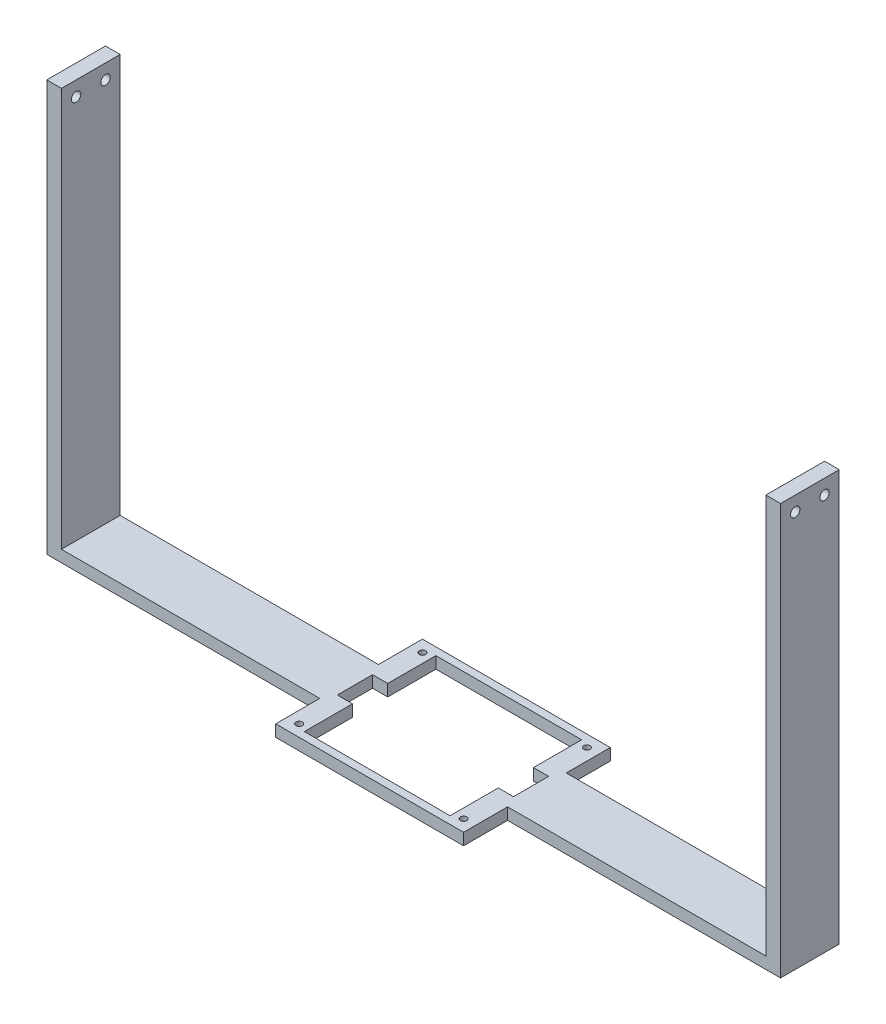
ISO-10303-21;
HEADER;
FILE_DESCRIPTION(('STEP AP214'),'2;1');
FILE_NAME('part.step','',(''),(''),'','','');
FILE_SCHEMA(('AUTOMOTIVE_DESIGN { 1 0 10303 214 1 1 1 1 }'));
ENDSEC;
DATA;
#1=APPLICATION_CONTEXT('core data for automotive mechanical design processes');
#2=APPLICATION_PROTOCOL_DEFINITION('international standard','automotive_design',2000,#1);
#3=PRODUCT_CONTEXT('',#1,'mechanical');
#4=PRODUCT('Part','Part','',(#3));
#5=PRODUCT_RELATED_PRODUCT_CATEGORY('part','',(#4));
#6=PRODUCT_DEFINITION_FORMATION('','',#4);
#7=PRODUCT_DEFINITION_CONTEXT('part definition',#1,'design');
#8=PRODUCT_DEFINITION('design','',#6,#7);
#9=PRODUCT_DEFINITION_SHAPE('','',#8);
#10=(LENGTH_UNIT() NAMED_UNIT(*) SI_UNIT(.MILLI.,.METRE.));
#11=(NAMED_UNIT(*) PLANE_ANGLE_UNIT() SI_UNIT($,.RADIAN.));
#12=(NAMED_UNIT(*) SI_UNIT($,.STERADIAN.) SOLID_ANGLE_UNIT());
#13=UNCERTAINTY_MEASURE_WITH_UNIT(LENGTH_MEASURE(1.E-05),#10,'distance_accuracy_value','');
#14=(GEOMETRIC_REPRESENTATION_CONTEXT(3) GLOBAL_UNCERTAINTY_ASSIGNED_CONTEXT((#13)) GLOBAL_UNIT_ASSIGNED_CONTEXT((#10,
#11,#12)) REPRESENTATION_CONTEXT('',''));
#15=CARTESIAN_POINT('',(0.,0.,0.));
#16=DIRECTION('',(0.,0.,1.));
#17=DIRECTION('',(1.,0.,0.));
#18=AXIS2_PLACEMENT_3D('',#15,#16,#17);
#19=CARTESIAN_POINT('',(-30.,4.,-6.));
#20=DIRECTION('',(0.,0.,1.));
#21=DIRECTION('',(1.,0.,0.));
#22=AXIS2_PLACEMENT_3D('',#19,#20,#21);
#23=PLANE('',#22);
#24=DIRECTION('',(0.,1.,0.));
#25=VECTOR('',#24,1.);
#26=CARTESIAN_POINT('',(24.8266606950776,4.,-6.));
#27=LINE('',#26,#25);
#28=CARTESIAN_POINT('',(24.8266606950776,0.,-6.));
#29=VERTEX_POINT('',#28);
#30=CARTESIAN_POINT('',(24.8266606950776,4.,-6.));
#31=VERTEX_POINT('',#30);
#32=EDGE_CURVE('E269',#29,#31,#27,.T.);
#33=ORIENTED_EDGE('',*,*,#32,.F.);
#34=DIRECTION('',(-1.,0.,0.));
#35=VECTOR('',#34,1.);
#36=CARTESIAN_POINT('',(-30.,0.,-6.));
#37=LINE('',#36,#35);
#38=CARTESIAN_POINT('',(30.,0.,-6.));
#39=VERTEX_POINT('',#38);
#40=EDGE_CURVE('E245',#39,#29,#37,.T.);
#41=ORIENTED_EDGE('',*,*,#40,.F.);
#42=DIRECTION('',(0.,-1.,0.));
#43=VECTOR('',#42,1.);
#44=CARTESIAN_POINT('',(30.,4.,-6.));
#45=LINE('',#44,#43);
#46=CARTESIAN_POINT('',(30.,4.,-6.));
#47=VERTEX_POINT('',#46);
#48=EDGE_CURVE('E442',#47,#39,#45,.T.);
#49=ORIENTED_EDGE('',*,*,#48,.F.);
#50=DIRECTION('',(-1.,0.,0.));
#51=VECTOR('',#50,1.);
#52=CARTESIAN_POINT('',(-30.,4.,-6.));
#53=LINE('',#52,#51);
#54=EDGE_CURVE('E415',#47,#31,#53,.T.);
#55=ORIENTED_EDGE('',*,*,#54,.T.);
#56=EDGE_LOOP('',(#33,#41,#49,#55));
#57=FACE_BOUND('',#56,.T.);
#58=ADVANCED_FACE('F35',(#57),#23,.T.);
#59=CARTESIAN_POINT('',(-30.,4.,6.));
#60=DIRECTION('',(0.,0.,-1.));
#61=DIRECTION('',(-1.,0.,0.));
#62=AXIS2_PLACEMENT_3D('',#59,#60,#61);
#63=PLANE('',#62);
#64=DIRECTION('',(0.,-1.,0.));
#65=VECTOR('',#64,1.);
#66=CARTESIAN_POINT('',(24.8266606950776,4.,6.));
#67=LINE('',#66,#65);
#68=CARTESIAN_POINT('',(24.8266606950776,4.,6.));
#69=VERTEX_POINT('',#68);
#70=CARTESIAN_POINT('',(24.8266606950776,0.,6.));
#71=VERTEX_POINT('',#70);
#72=EDGE_CURVE('E11',#69,#71,#67,.T.);
#73=ORIENTED_EDGE('',*,*,#72,.F.);
#74=DIRECTION('',(1.,0.,0.));
#75=VECTOR('',#74,1.);
#76=CARTESIAN_POINT('',(-30.,4.,6.));
#77=LINE('',#76,#75);
#78=CARTESIAN_POINT('',(30.,4.,6.));
#79=VERTEX_POINT('',#78);
#80=EDGE_CURVE('E421',#69,#79,#77,.T.);
#81=ORIENTED_EDGE('',*,*,#80,.T.);
#82=DIRECTION('',(0.,-1.,0.));
#83=VECTOR('',#82,1.);
#84=CARTESIAN_POINT('',(30.,4.,6.));
#85=LINE('',#84,#83);
#86=CARTESIAN_POINT('',(30.,0.,6.));
#87=VERTEX_POINT('',#86);
#88=EDGE_CURVE('E425',#79,#87,#85,.T.);
#89=ORIENTED_EDGE('',*,*,#88,.T.);
#90=DIRECTION('',(1.,0.,0.));
#91=VECTOR('',#90,1.);
#92=CARTESIAN_POINT('',(-30.,0.,6.));
#93=LINE('',#92,#91);
#94=EDGE_CURVE('E432',#71,#87,#93,.T.);
#95=ORIENTED_EDGE('',*,*,#94,.F.);
#96=EDGE_LOOP('',(#73,#81,#89,#95));
#97=FACE_BOUND('',#96,.T.);
#98=ADVANCED_FACE('F508',(#97),#63,.T.);
#99=CARTESIAN_POINT('',(125.,4.,9.99999999999997));
#100=DIRECTION('',(0.,0.,-1.));
#101=DIRECTION('',(-1.,0.,0.));
#102=AXIS2_PLACEMENT_3D('',#99,#100,#101);
#103=PLANE('',#102);
#104=DIRECTION('',(0.,1.,0.));
#105=VECTOR('',#104,1.);
#106=CARTESIAN_POINT('',(32.,0.,9.99999999999999));
#107=LINE('',#106,#105);
#108=CARTESIAN_POINT('',(32.,0.,9.99999999999999));
#109=VERTEX_POINT('',#108);
#110=CARTESIAN_POINT('',(32.,4.,9.99999999999999));
#111=VERTEX_POINT('',#110);
#112=EDGE_CURVE('E307',#109,#111,#107,.T.);
#113=ORIENTED_EDGE('',*,*,#112,.F.);
#114=DIRECTION('',(1.,0.,0.));
#115=VECTOR('',#114,1.);
#116=CARTESIAN_POINT('',(125.,0.,9.99999999999997));
#117=LINE('',#116,#115);
#118=CARTESIAN_POINT('',(125.,0.,9.99999999999997));
#119=VERTEX_POINT('',#118);
#120=EDGE_CURVE('E457',#109,#119,#117,.T.);
#121=ORIENTED_EDGE('',*,*,#120,.T.);
#122=DIRECTION('',(0.,-1.,0.));
#123=VECTOR('',#122,1.);
#124=CARTESIAN_POINT('',(125.,4.,9.99999999999997));
#125=LINE('',#124,#123);
#126=CARTESIAN_POINT('',(125.,140.,10.));
#127=VERTEX_POINT('',#126);
#128=EDGE_CURVE('E472',#127,#119,#125,.T.);
#129=ORIENTED_EDGE('',*,*,#128,.F.);
#130=DIRECTION('',(1.,0.,0.));
#131=VECTOR('',#130,1.);
#132=CARTESIAN_POINT('',(120.,140.,10.));
#133=LINE('',#132,#131);
#134=CARTESIAN_POINT('',(120.,140.,10.));
#135=VERTEX_POINT('',#134);
#136=EDGE_CURVE('E370',#135,#127,#133,.T.);
#137=ORIENTED_EDGE('',*,*,#136,.F.);
#138=DIRECTION('',(0.,1.,0.));
#139=VECTOR('',#138,1.);
#140=CARTESIAN_POINT('',(120.,0.,10.));
#141=LINE('',#140,#139);
#142=CARTESIAN_POINT('',(120.,4.,9.99999999999997));
#143=VERTEX_POINT('',#142);
#144=EDGE_CURVE('E365',#143,#135,#141,.T.);
#145=ORIENTED_EDGE('',*,*,#144,.F.);
#146=DIRECTION('',(1.,0.,0.));
#147=VECTOR('',#146,1.);
#148=CARTESIAN_POINT('',(125.,4.,9.99999999999997));
#149=LINE('',#148,#147);
#150=EDGE_CURVE('E450',#111,#143,#149,.T.);
#151=ORIENTED_EDGE('',*,*,#150,.F.);
#152=EDGE_LOOP('',(#113,#121,#129,#137,#145,#151));
#153=FACE_BOUND('',#152,.T.);
#154=ADVANCED_FACE('F522',(#153),#103,.F.);
#155=CARTESIAN_POINT('',(125.,4.,-10.0000000000001));
#156=DIRECTION('',(0.,0.,1.));
#157=DIRECTION('',(1.,0.,0.));
#158=AXIS2_PLACEMENT_3D('',#155,#156,#157);
#159=PLANE('',#158);
#160=DIRECTION('',(0.,1.,0.));
#161=VECTOR('',#160,1.);
#162=CARTESIAN_POINT('',(-32.,0.,-10.));
#163=LINE('',#162,#161);
#164=CARTESIAN_POINT('',(-32.,0.,-10.));
#165=VERTEX_POINT('',#164);
#166=CARTESIAN_POINT('',(-32.,4.,-10.));
#167=VERTEX_POINT('',#166);
#168=EDGE_CURVE('E331',#165,#167,#163,.T.);
#169=ORIENTED_EDGE('',*,*,#168,.F.);
#170=DIRECTION('',(-1.,0.,0.));
#171=VECTOR('',#170,1.);
#172=CARTESIAN_POINT('',(125.,0.,-10.0000000000001));
#173=LINE('',#172,#171);
#174=CARTESIAN_POINT('',(-125.,0.,-9.99999999999997));
#175=VERTEX_POINT('',#174);
#176=EDGE_CURVE('E463',#165,#175,#173,.T.);
#177=ORIENTED_EDGE('',*,*,#176,.T.);
#178=DIRECTION('',(0.,-1.,0.));
#179=VECTOR('',#178,1.);
#180=CARTESIAN_POINT('',(-125.,4.,-9.99999999999997));
#181=LINE('',#180,#179);
#182=CARTESIAN_POINT('',(-125.,140.,-9.99999999999997));
#183=VERTEX_POINT('',#182);
#184=EDGE_CURVE('E454',#183,#175,#181,.T.);
#185=ORIENTED_EDGE('',*,*,#184,.F.);
#186=DIRECTION('',(-1.,0.,0.));
#187=VECTOR('',#186,1.);
#188=CARTESIAN_POINT('',(-120.,140.,-9.99999999999997));
#189=LINE('',#188,#187);
#190=CARTESIAN_POINT('',(-120.,140.,-9.99999999999997));
#191=VERTEX_POINT('',#190);
#192=EDGE_CURVE('E402',#191,#183,#189,.T.);
#193=ORIENTED_EDGE('',*,*,#192,.F.);
#194=DIRECTION('',(0.,-1.,0.));
#195=VECTOR('',#194,1.);
#196=CARTESIAN_POINT('',(-120.,0.,-9.99999999999997));
#197=LINE('',#196,#195);
#198=CARTESIAN_POINT('',(-120.,4.,-9.99999999999997));
#199=VERTEX_POINT('',#198);
#200=EDGE_CURVE('E396',#191,#199,#197,.T.);
#201=ORIENTED_EDGE('',*,*,#200,.T.);
#202=DIRECTION('',(-1.,0.,0.));
#203=VECTOR('',#202,1.);
#204=CARTESIAN_POINT('',(125.,4.,-10.0000000000001));
#205=LINE('',#204,#203);
#206=EDGE_CURVE('E449',#167,#199,#205,.T.);
#207=ORIENTED_EDGE('',*,*,#206,.F.);
#208=EDGE_LOOP('',(#169,#177,#185,#193,#201,#207));
#209=FACE_BOUND('',#208,.T.);
#210=ADVANCED_FACE('F538',(#209),#159,.F.);
#211=CARTESIAN_POINT('',(0.,4.,0.));
#212=DIRECTION('',(0.,-1.,0.));
#213=DIRECTION('',(0.,0.,-1.));
#214=AXIS2_PLACEMENT_3D('',#211,#212,#213);
#215=PLANE('',#214);
#216=ORIENTED_EDGE('',*,*,#80,.F.);
#217=DIRECTION('',(0.,0.,-1.));
#218=VECTOR('',#217,1.);
#219=CARTESIAN_POINT('',(24.8266606950776,4.,-22.4076506082642));
#220=LINE('',#219,#218);
#221=CARTESIAN_POINT('',(24.8266606950776,4.,22.4076506082642));
#222=VERTEX_POINT('',#221);
#223=EDGE_CURVE('E255',#222,#69,#220,.T.);
#224=ORIENTED_EDGE('',*,*,#223,.F.);
#225=DIRECTION('',(1.,0.,0.));
#226=VECTOR('',#225,1.);
#227=CARTESIAN_POINT('',(-24.8266606950776,4.,22.4076506082642));
#228=LINE('',#227,#226);
#229=CARTESIAN_POINT('',(-24.8266606950776,4.,22.4076506082642));
#230=VERTEX_POINT('',#229);
#231=EDGE_CURVE('E246',#230,#222,#228,.T.);
#232=ORIENTED_EDGE('',*,*,#231,.F.);
#233=DIRECTION('',(0.,0.,1.));
#234=VECTOR('',#233,1.);
#235=CARTESIAN_POINT('',(-24.8266606950776,4.,-22.4076506082642));
#236=LINE('',#235,#234);
#237=CARTESIAN_POINT('',(-24.8266606950776,4.,6.));
#238=VERTEX_POINT('',#237);
#239=EDGE_CURVE('E259',#238,#230,#236,.T.);
#240=ORIENTED_EDGE('',*,*,#239,.F.);
#241=CARTESIAN_POINT('',(-30.,4.,6.));
#242=VERTEX_POINT('',#241);
#243=EDGE_CURVE('E422',#242,#238,#77,.T.);
#244=ORIENTED_EDGE('',*,*,#243,.F.);
#245=DIRECTION('',(0.,0.,1.));
#246=VECTOR('',#245,1.);
#247=CARTESIAN_POINT('',(-30.,4.,6.));
#248=LINE('',#247,#246);
#249=CARTESIAN_POINT('',(-30.,4.,-6.));
#250=VERTEX_POINT('',#249);
#251=EDGE_CURVE('E418',#250,#242,#248,.T.);
#252=ORIENTED_EDGE('',*,*,#251,.F.);
#253=CARTESIAN_POINT('',(-24.8266606950776,4.,-6.));
#254=VERTEX_POINT('',#253);
#255=EDGE_CURVE('E413',#254,#250,#53,.T.);
#256=ORIENTED_EDGE('',*,*,#255,.F.);
#257=CARTESIAN_POINT('',(-24.8266606950776,4.,-22.4076506082642));
#258=VERTEX_POINT('',#257);
#259=EDGE_CURVE('E50',#258,#254,#236,.T.);
#260=ORIENTED_EDGE('',*,*,#259,.F.);
#261=DIRECTION('',(-1.,0.,0.));
#262=VECTOR('',#261,1.);
#263=CARTESIAN_POINT('',(-24.8266606950776,4.,-22.4076506082642));
#264=LINE('',#263,#262);
#265=CARTESIAN_POINT('',(24.8266606950776,4.,-22.4076506082642));
#266=VERTEX_POINT('',#265);
#267=EDGE_CURVE('E257',#266,#258,#264,.T.);
#268=ORIENTED_EDGE('',*,*,#267,.F.);
#269=EDGE_CURVE('E225',#31,#266,#220,.T.);
#270=ORIENTED_EDGE('',*,*,#269,.F.);
#271=ORIENTED_EDGE('',*,*,#54,.F.);
#272=DIRECTION('',(0.,0.,-1.));
#273=VECTOR('',#272,1.);
#274=CARTESIAN_POINT('',(30.,4.,6.));
#275=LINE('',#274,#273);
#276=EDGE_CURVE('E411',#79,#47,#275,.T.);
#277=ORIENTED_EDGE('',*,*,#276,.F.);
#278=EDGE_LOOP('',(#216,#224,#232,#240,#244,#252,#256,#260,#268,#270,#271,#277));
#279=FACE_BOUND('',#278,.T.);
#280=DIRECTION('',(0.,0.,1.));
#281=VECTOR('',#280,1.);
#282=CARTESIAN_POINT('',(120.,4.,0.));
#283=LINE('',#282,#281);
#284=CARTESIAN_POINT('',(120.,4.,-9.99999999999997));
#285=VERTEX_POINT('',#284);
#286=EDGE_CURVE('E373',#285,#143,#283,.T.);
#287=ORIENTED_EDGE('',*,*,#286,.F.);
#288=CARTESIAN_POINT('',(32.,4.,-10.));
#289=VERTEX_POINT('',#288);
#290=EDGE_CURVE('E451',#285,#289,#205,.T.);
#291=ORIENTED_EDGE('',*,*,#290,.T.);
#292=DIRECTION('',(0.,0.,-1.));
#293=VECTOR('',#292,1.);
#294=CARTESIAN_POINT('',(32.,4.,-25.));
#295=LINE('',#294,#293);
#296=CARTESIAN_POINT('',(32.,4.,-25.));
#297=VERTEX_POINT('',#296);
#298=EDGE_CURVE('E334',#289,#297,#295,.T.);
#299=ORIENTED_EDGE('',*,*,#298,.T.);
#300=DIRECTION('',(-1.,0.,0.));
#301=VECTOR('',#300,1.);
#302=CARTESIAN_POINT('',(32.,4.,-25.));
#303=LINE('',#302,#301);
#304=CARTESIAN_POINT('',(-32.,4.,-25.));
#305=VERTEX_POINT('',#304);
#306=EDGE_CURVE('E325',#297,#305,#303,.T.);
#307=ORIENTED_EDGE('',*,*,#306,.T.);
#308=DIRECTION('',(0.,0.,1.));
#309=VECTOR('',#308,1.);
#310=CARTESIAN_POINT('',(-32.,4.,-25.));
#311=LINE('',#310,#309);
#312=EDGE_CURVE('E319',#305,#167,#311,.T.);
#313=ORIENTED_EDGE('',*,*,#312,.T.);
#314=ORIENTED_EDGE('',*,*,#206,.T.);
#315=DIRECTION('',(0.,0.,-1.));
#316=VECTOR('',#315,1.);
#317=CARTESIAN_POINT('',(-120.,4.,0.));
#318=LINE('',#317,#316);
#319=CARTESIAN_POINT('',(-120.,4.,10.));
#320=VERTEX_POINT('',#319);
#321=EDGE_CURVE('E405',#320,#199,#318,.T.);
#322=ORIENTED_EDGE('',*,*,#321,.F.);
#323=CARTESIAN_POINT('',(-32.,4.,10.));
#324=VERTEX_POINT('',#323);
#325=EDGE_CURVE('E446',#320,#324,#149,.T.);
#326=ORIENTED_EDGE('',*,*,#325,.T.);
#327=DIRECTION('',(0.,0.,1.));
#328=VECTOR('',#327,1.);
#329=CARTESIAN_POINT('',(-32.,4.,25.));
#330=LINE('',#329,#328);
#331=CARTESIAN_POINT('',(-32.,4.,25.));
#332=VERTEX_POINT('',#331);
#333=EDGE_CURVE('E288',#324,#332,#330,.T.);
#334=ORIENTED_EDGE('',*,*,#333,.T.);
#335=DIRECTION('',(1.,0.,0.));
#336=VECTOR('',#335,1.);
#337=CARTESIAN_POINT('',(32.,4.,25.));
#338=LINE('',#337,#336);
#339=CARTESIAN_POINT('',(32.,4.,25.));
#340=VERTEX_POINT('',#339);
#341=EDGE_CURVE('E281',#332,#340,#338,.T.);
#342=ORIENTED_EDGE('',*,*,#341,.T.);
#343=DIRECTION('',(0.,0.,-1.));
#344=VECTOR('',#343,1.);
#345=CARTESIAN_POINT('',(32.,4.,25.));
#346=LINE('',#345,#344);
#347=EDGE_CURVE('E296',#340,#111,#346,.T.);
#348=ORIENTED_EDGE('',*,*,#347,.T.);
#349=ORIENTED_EDGE('',*,*,#150,.T.);
#350=EDGE_LOOP('',(#287,#291,#299,#307,#313,#314,#322,#326,#334,#342,#348,#349));
#351=FACE_BOUND('',#350,.T.);
#352=CARTESIAN_POINT('',(28.,4.,-21.));
#353=DIRECTION('',(0.,1.,0.));
#354=DIRECTION('',(0.,0.,1.));
#355=AXIS2_PLACEMENT_3D('',#352,#353,#354);
#356=CIRCLE('',#355,1.1);
#357=CARTESIAN_POINT('',(28.,4.,-19.9));
#358=VERTEX_POINT('',#357);
#359=EDGE_CURVE('E303',#358,#358,#356,.T.);
#360=ORIENTED_EDGE('',*,*,#359,.F.);
#361=EDGE_LOOP('',(#360));
#362=FACE_BOUND('',#361,.T.);
#363=CARTESIAN_POINT('',(-28.,4.,-21.));
#364=DIRECTION('',(0.,1.,0.));
#365=DIRECTION('',(0.,0.,1.));
#366=AXIS2_PLACEMENT_3D('',#363,#364,#365);
#367=CIRCLE('',#366,1.1);
#368=CARTESIAN_POINT('',(-28.,4.,-19.9));
#369=VERTEX_POINT('',#368);
#370=EDGE_CURVE('E313',#369,#369,#367,.T.);
#371=ORIENTED_EDGE('',*,*,#370,.F.);
#372=EDGE_LOOP('',(#371));
#373=FACE_BOUND('',#372,.T.);
#374=CARTESIAN_POINT('',(28.,4.,21.));
#375=DIRECTION('',(0.,1.,0.));
#376=DIRECTION('',(0.,0.,1.));
#377=AXIS2_PLACEMENT_3D('',#374,#375,#376);
#378=CIRCLE('',#377,1.1);
#379=CARTESIAN_POINT('',(28.,4.,22.1));
#380=VERTEX_POINT('',#379);
#381=EDGE_CURVE('E271',#380,#380,#378,.T.);
#382=ORIENTED_EDGE('',*,*,#381,.F.);
#383=EDGE_LOOP('',(#382));
#384=FACE_BOUND('',#383,.T.);
#385=CARTESIAN_POINT('',(-28.,4.,21.));
#386=DIRECTION('',(0.,1.,0.));
#387=DIRECTION('',(0.,0.,1.));
#388=AXIS2_PLACEMENT_3D('',#385,#386,#387);
#389=CIRCLE('',#388,1.1);
#390=CARTESIAN_POINT('',(-28.,4.,22.1));
#391=VERTEX_POINT('',#390);
#392=EDGE_CURVE('E275',#391,#391,#389,.T.);
#393=ORIENTED_EDGE('',*,*,#392,.F.);
#394=EDGE_LOOP('',(#393));
#395=FACE_BOUND('',#394,.T.);
#396=ADVANCED_FACE('F485',(#279,#351,#362,#373,#384,#395),#215,.F.);
#397=CARTESIAN_POINT('',(0.,0.,0.));
#398=DIRECTION('',(0.,-1.,0.));
#399=DIRECTION('',(0.,0.,-1.));
#400=AXIS2_PLACEMENT_3D('',#397,#398,#399);
#401=PLANE('',#400);
#402=DIRECTION('',(0.,0.,-1.));
#403=VECTOR('',#402,1.);
#404=CARTESIAN_POINT('',(24.8266606950776,0.,-22.4076506082642));
#405=LINE('',#404,#403);
#406=CARTESIAN_POINT('',(24.8266606950776,0.,22.4076506082642));
#407=VERTEX_POINT('',#406);
#408=EDGE_CURVE('E238',#407,#71,#405,.T.);
#409=ORIENTED_EDGE('',*,*,#408,.T.);
#410=ORIENTED_EDGE('',*,*,#94,.T.);
#411=DIRECTION('',(0.,0.,-1.));
#412=VECTOR('',#411,1.);
#413=CARTESIAN_POINT('',(30.,0.,6.));
#414=LINE('',#413,#412);
#415=EDGE_CURVE('E410',#87,#39,#414,.T.);
#416=ORIENTED_EDGE('',*,*,#415,.T.);
#417=ORIENTED_EDGE('',*,*,#40,.T.);
#418=CARTESIAN_POINT('',(24.8266606950776,0.,-22.4076506082642));
#419=VERTEX_POINT('',#418);
#420=EDGE_CURVE('E222',#29,#419,#405,.T.);
#421=ORIENTED_EDGE('',*,*,#420,.T.);
#422=DIRECTION('',(-1.,0.,0.));
#423=VECTOR('',#422,1.);
#424=CARTESIAN_POINT('',(-24.8266606950776,0.,-22.4076506082642));
#425=LINE('',#424,#423);
#426=CARTESIAN_POINT('',(-24.8266606950776,0.,-22.4076506082642));
#427=VERTEX_POINT('',#426);
#428=EDGE_CURVE('E233',#419,#427,#425,.T.);
#429=ORIENTED_EDGE('',*,*,#428,.T.);
#430=DIRECTION('',(0.,0.,1.));
#431=VECTOR('',#430,1.);
#432=CARTESIAN_POINT('',(-24.8266606950776,0.,-22.4076506082642));
#433=LINE('',#432,#431);
#434=CARTESIAN_POINT('',(-24.8266606950776,0.,-6.));
#435=VERTEX_POINT('',#434);
#436=EDGE_CURVE('E251',#427,#435,#433,.T.);
#437=ORIENTED_EDGE('',*,*,#436,.T.);
#438=CARTESIAN_POINT('',(-30.,0.,-6.));
#439=VERTEX_POINT('',#438);
#440=EDGE_CURVE('E427',#435,#439,#37,.T.);
#441=ORIENTED_EDGE('',*,*,#440,.T.);
#442=DIRECTION('',(0.,0.,1.));
#443=VECTOR('',#442,1.);
#444=CARTESIAN_POINT('',(-30.,0.,6.));
#445=LINE('',#444,#443);
#446=CARTESIAN_POINT('',(-30.,0.,6.));
#447=VERTEX_POINT('',#446);
#448=EDGE_CURVE('E429',#439,#447,#445,.T.);
#449=ORIENTED_EDGE('',*,*,#448,.T.);
#450=CARTESIAN_POINT('',(-24.8266606950776,0.,6.));
#451=VERTEX_POINT('',#450);
#452=EDGE_CURVE('E414',#447,#451,#93,.T.);
#453=ORIENTED_EDGE('',*,*,#452,.T.);
#454=CARTESIAN_POINT('',(-24.8266606950776,0.,22.4076506082642));
#455=VERTEX_POINT('',#454);
#456=EDGE_CURVE('E58',#451,#455,#433,.T.);
#457=ORIENTED_EDGE('',*,*,#456,.T.);
#458=DIRECTION('',(1.,0.,0.));
#459=VECTOR('',#458,1.);
#460=CARTESIAN_POINT('',(-24.8266606950776,0.,22.4076506082642));
#461=LINE('',#460,#459);
#462=EDGE_CURVE('E230',#455,#407,#461,.T.);
#463=ORIENTED_EDGE('',*,*,#462,.T.);
#464=EDGE_LOOP('',(#409,#410,#416,#417,#421,#429,#437,#441,#449,#453,#457,#463));
#465=FACE_BOUND('',#464,.T.);
#466=DIRECTION('',(0.,0.,-1.));
#467=VECTOR('',#466,1.);
#468=CARTESIAN_POINT('',(125.,0.,-10.0000000000001));
#469=LINE('',#468,#467);
#470=CARTESIAN_POINT('',(125.,0.,-10.0000000000001));
#471=VERTEX_POINT('',#470);
#472=EDGE_CURVE('E461',#119,#471,#469,.T.);
#473=ORIENTED_EDGE('',*,*,#472,.F.);
#474=ORIENTED_EDGE('',*,*,#120,.F.);
#475=DIRECTION('',(0.,0.,-1.));
#476=VECTOR('',#475,1.);
#477=CARTESIAN_POINT('',(32.,0.,25.));
#478=LINE('',#477,#476);
#479=CARTESIAN_POINT('',(32.,0.,25.));
#480=VERTEX_POINT('',#479);
#481=EDGE_CURVE('E287',#480,#109,#478,.T.);
#482=ORIENTED_EDGE('',*,*,#481,.F.);
#483=DIRECTION('',(1.,0.,0.));
#484=VECTOR('',#483,1.);
#485=CARTESIAN_POINT('',(32.,0.,25.));
#486=LINE('',#485,#484);
#487=CARTESIAN_POINT('',(-32.,0.,25.));
#488=VERTEX_POINT('',#487);
#489=EDGE_CURVE('E284',#488,#480,#486,.T.);
#490=ORIENTED_EDGE('',*,*,#489,.F.);
#491=DIRECTION('',(0.,0.,1.));
#492=VECTOR('',#491,1.);
#493=CARTESIAN_POINT('',(-32.,0.,25.));
#494=LINE('',#493,#492);
#495=CARTESIAN_POINT('',(-32.,0.,9.99999999999999));
#496=VERTEX_POINT('',#495);
#497=EDGE_CURVE('E290',#496,#488,#494,.T.);
#498=ORIENTED_EDGE('',*,*,#497,.F.);
#499=CARTESIAN_POINT('',(-125.,0.,10.));
#500=VERTEX_POINT('',#499);
#501=EDGE_CURVE('E458',#500,#496,#117,.T.);
#502=ORIENTED_EDGE('',*,*,#501,.F.);
#503=DIRECTION('',(0.,0.,1.));
#504=VECTOR('',#503,1.);
#505=CARTESIAN_POINT('',(-125.,0.,-9.99999999999997));
#506=LINE('',#505,#504);
#507=EDGE_CURVE('E445',#175,#500,#506,.T.);
#508=ORIENTED_EDGE('',*,*,#507,.F.);
#509=ORIENTED_EDGE('',*,*,#176,.F.);
#510=DIRECTION('',(0.,0.,1.));
#511=VECTOR('',#510,1.);
#512=CARTESIAN_POINT('',(-32.,0.,-25.));
#513=LINE('',#512,#511);
#514=CARTESIAN_POINT('',(-32.,0.,-25.));
#515=VERTEX_POINT('',#514);
#516=EDGE_CURVE('E322',#515,#165,#513,.T.);
#517=ORIENTED_EDGE('',*,*,#516,.F.);
#518=DIRECTION('',(-1.,0.,0.));
#519=VECTOR('',#518,1.);
#520=CARTESIAN_POINT('',(32.,0.,-25.));
#521=LINE('',#520,#519);
#522=CARTESIAN_POINT('',(32.,0.,-25.));
#523=VERTEX_POINT('',#522);
#524=EDGE_CURVE('E328',#523,#515,#521,.T.);
#525=ORIENTED_EDGE('',*,*,#524,.F.);
#526=DIRECTION('',(0.,0.,-1.));
#527=VECTOR('',#526,1.);
#528=CARTESIAN_POINT('',(32.,0.,-25.));
#529=LINE('',#528,#527);
#530=CARTESIAN_POINT('',(32.,0.,-10.));
#531=VERTEX_POINT('',#530);
#532=EDGE_CURVE('E324',#531,#523,#529,.T.);
#533=ORIENTED_EDGE('',*,*,#532,.F.);
#534=EDGE_CURVE('E464',#471,#531,#173,.T.);
#535=ORIENTED_EDGE('',*,*,#534,.F.);
#536=EDGE_LOOP('',(#473,#474,#482,#490,#498,#502,#508,#509,#517,#525,#533,#535));
#537=FACE_BOUND('',#536,.T.);
#538=CARTESIAN_POINT('',(28.,0.,-21.));
#539=DIRECTION('',(0.,1.,0.));
#540=DIRECTION('',(0.,0.,1.));
#541=AXIS2_PLACEMENT_3D('',#538,#539,#540);
#542=CIRCLE('',#541,1.1);
#543=CARTESIAN_POINT('',(28.,0.,-19.9));
#544=VERTEX_POINT('',#543);
#545=EDGE_CURVE('E310',#544,#544,#542,.T.);
#546=ORIENTED_EDGE('',*,*,#545,.T.);
#547=EDGE_LOOP('',(#546));
#548=FACE_BOUND('',#547,.T.);
#549=CARTESIAN_POINT('',(-28.,0.,-21.));
#550=DIRECTION('',(0.,1.,0.));
#551=DIRECTION('',(0.,0.,1.));
#552=AXIS2_PLACEMENT_3D('',#549,#550,#551);
#553=CIRCLE('',#552,1.1);
#554=CARTESIAN_POINT('',(-28.,0.,-19.9));
#555=VERTEX_POINT('',#554);
#556=EDGE_CURVE('E316',#555,#555,#553,.T.);
#557=ORIENTED_EDGE('',*,*,#556,.T.);
#558=EDGE_LOOP('',(#557));
#559=FACE_BOUND('',#558,.T.);
#560=CARTESIAN_POINT('',(28.,0.,21.));
#561=DIRECTION('',(0.,1.,0.));
#562=DIRECTION('',(0.,0.,1.));
#563=AXIS2_PLACEMENT_3D('',#560,#561,#562);
#564=CIRCLE('',#563,1.1);
#565=CARTESIAN_POINT('',(28.,0.,22.1));
#566=VERTEX_POINT('',#565);
#567=EDGE_CURVE('E272',#566,#566,#564,.T.);
#568=ORIENTED_EDGE('',*,*,#567,.T.);
#569=EDGE_LOOP('',(#568));
#570=FACE_BOUND('',#569,.T.);
#571=CARTESIAN_POINT('',(-28.,0.,21.));
#572=DIRECTION('',(0.,1.,0.));
#573=DIRECTION('',(0.,0.,1.));
#574=AXIS2_PLACEMENT_3D('',#571,#572,#573);
#575=CIRCLE('',#574,1.1);
#576=CARTESIAN_POINT('',(-28.,0.,22.1));
#577=VERTEX_POINT('',#576);
#578=EDGE_CURVE('E278',#577,#577,#575,.T.);
#579=ORIENTED_EDGE('',*,*,#578,.T.);
#580=EDGE_LOOP('',(#579));
#581=FACE_BOUND('',#580,.T.);
#582=ADVANCED_FACE('F242',(#465,#537,#548,#559,#570,#581),#401,.T.);
#583=CARTESIAN_POINT('',(-125.,4.,-9.99999999999997));
#584=DIRECTION('',(1.,0.,0.));
#585=DIRECTION('',(0.,0.,-1.));
#586=AXIS2_PLACEMENT_3D('',#583,#584,#585);
#587=PLANE('',#586);
#588=ORIENTED_EDGE('',*,*,#507,.T.);
#589=DIRECTION('',(0.,-1.,0.));
#590=VECTOR('',#589,1.);
#591=CARTESIAN_POINT('',(-125.,4.,10.));
#592=LINE('',#591,#590);
#593=CARTESIAN_POINT('',(-125.,140.,10.));
#594=VERTEX_POINT('',#593);
#595=EDGE_CURVE('E475',#594,#500,#592,.T.);
#596=ORIENTED_EDGE('',*,*,#595,.F.);
#597=DIRECTION('',(0.,0.,-1.));
#598=VECTOR('',#597,1.);
#599=CARTESIAN_POINT('',(-125.,140.,10.));
#600=LINE('',#599,#598);
#601=EDGE_CURVE('E388',#594,#183,#600,.T.);
#602=ORIENTED_EDGE('',*,*,#601,.T.);
#603=ORIENTED_EDGE('',*,*,#184,.T.);
#604=EDGE_LOOP('',(#588,#596,#602,#603));
#605=FACE_BOUND('',#604,.T.);
#606=CARTESIAN_POINT('',(-125.,135.,-5.00000000000002));
#607=DIRECTION('',(-1.,0.,0.));
#608=DIRECTION('',(0.,0.,1.));
#609=AXIS2_PLACEMENT_3D('',#606,#607,#608);
#610=CIRCLE('',#609,1.6);
#611=CARTESIAN_POINT('',(-125.,135.,-3.40000000000002));
#612=VERTEX_POINT('',#611);
#613=EDGE_CURVE('E382',#612,#612,#610,.T.);
#614=ORIENTED_EDGE('',*,*,#613,.F.);
#615=EDGE_LOOP('',(#614));
#616=FACE_BOUND('',#615,.T.);
#617=CARTESIAN_POINT('',(-125.,135.,5.00000000000002));
#618=DIRECTION('',(-1.,0.,0.));
#619=DIRECTION('',(0.,0.,-1.));
#620=AXIS2_PLACEMENT_3D('',#617,#618,#619);
#621=CIRCLE('',#620,1.6);
#622=CARTESIAN_POINT('',(-125.,135.,3.40000000000002));
#623=VERTEX_POINT('',#622);
#624=EDGE_CURVE('E378',#623,#623,#621,.T.);
#625=ORIENTED_EDGE('',*,*,#624,.F.);
#626=EDGE_LOOP('',(#625));
#627=FACE_BOUND('',#626,.T.);
#628=ADVANCED_FACE('F37',(#605,#616,#627),#587,.F.);
#629=ORIENTED_EDGE('',*,*,#501,.T.);
#630=DIRECTION('',(0.,1.,0.));
#631=VECTOR('',#630,1.);
#632=CARTESIAN_POINT('',(-32.,0.,9.99999999999999));
#633=LINE('',#632,#631);
#634=EDGE_CURVE('E304',#496,#324,#633,.T.);
#635=ORIENTED_EDGE('',*,*,#634,.T.);
#636=ORIENTED_EDGE('',*,*,#325,.F.);
#637=DIRECTION('',(0.,1.,0.));
#638=VECTOR('',#637,1.);
#639=CARTESIAN_POINT('',(-120.,0.,10.));
#640=LINE('',#639,#638);
#641=CARTESIAN_POINT('',(-120.,140.,10.));
#642=VERTEX_POINT('',#641);
#643=EDGE_CURVE('E391',#320,#642,#640,.T.);
#644=ORIENTED_EDGE('',*,*,#643,.T.);
#645=DIRECTION('',(-1.,0.,0.));
#646=VECTOR('',#645,1.);
#647=CARTESIAN_POINT('',(-120.,140.,10.));
#648=LINE('',#647,#646);
#649=EDGE_CURVE('E399',#642,#594,#648,.T.);
#650=ORIENTED_EDGE('',*,*,#649,.T.);
#651=ORIENTED_EDGE('',*,*,#595,.T.);
#652=EDGE_LOOP('',(#629,#635,#636,#644,#650,#651));
#653=FACE_BOUND('',#652,.T.);
#654=ADVANCED_FACE('F545',(#653),#103,.F.);
#655=CARTESIAN_POINT('',(125.,4.,-10.0000000000001));
#656=DIRECTION('',(-1.,0.,0.));
#657=DIRECTION('',(0.,0.,1.));
#658=AXIS2_PLACEMENT_3D('',#655,#656,#657);
#659=PLANE('',#658);
#660=ORIENTED_EDGE('',*,*,#472,.T.);
#661=DIRECTION('',(0.,-1.,0.));
#662=VECTOR('',#661,1.);
#663=CARTESIAN_POINT('',(125.,4.,-10.0000000000001));
#664=LINE('',#663,#662);
#665=CARTESIAN_POINT('',(125.,140.,-9.99999999999997));
#666=VERTEX_POINT('',#665);
#667=EDGE_CURVE('E469',#666,#471,#664,.T.);
#668=ORIENTED_EDGE('',*,*,#667,.F.);
#669=DIRECTION('',(0.,0.,-1.));
#670=VECTOR('',#669,1.);
#671=CARTESIAN_POINT('',(125.,140.,10.));
#672=LINE('',#671,#670);
#673=EDGE_CURVE('E357',#127,#666,#672,.T.);
#674=ORIENTED_EDGE('',*,*,#673,.F.);
#675=ORIENTED_EDGE('',*,*,#128,.T.);
#676=EDGE_LOOP('',(#660,#668,#674,#675));
#677=FACE_BOUND('',#676,.T.);
#678=CARTESIAN_POINT('',(125.,135.,5.00000000000002));
#679=DIRECTION('',(-1.,0.,0.));
#680=DIRECTION('',(0.,0.,-1.));
#681=AXIS2_PLACEMENT_3D('',#678,#679,#680);
#682=CIRCLE('',#681,1.6);
#683=CARTESIAN_POINT('',(125.,135.,3.40000000000002));
#684=VERTEX_POINT('',#683);
#685=EDGE_CURVE('E341',#684,#684,#682,.T.);
#686=ORIENTED_EDGE('',*,*,#685,.T.);
#687=EDGE_LOOP('',(#686));
#688=FACE_BOUND('',#687,.T.);
#689=CARTESIAN_POINT('',(125.,135.,-5.00000000000002));
#690=DIRECTION('',(-1.,0.,0.));
#691=DIRECTION('',(0.,0.,1.));
#692=AXIS2_PLACEMENT_3D('',#689,#690,#691);
#693=CIRCLE('',#692,1.6);
#694=CARTESIAN_POINT('',(125.,135.,-3.40000000000002));
#695=VERTEX_POINT('',#694);
#696=EDGE_CURVE('E351',#695,#695,#693,.T.);
#697=ORIENTED_EDGE('',*,*,#696,.T.);
#698=EDGE_LOOP('',(#697));
#699=FACE_BOUND('',#698,.T.);
#700=ADVANCED_FACE('F535',(#677,#688,#699),#659,.F.);
#701=ORIENTED_EDGE('',*,*,#534,.T.);
#702=DIRECTION('',(0.,1.,0.));
#703=VECTOR('',#702,1.);
#704=CARTESIAN_POINT('',(32.,0.,-10.));
#705=LINE('',#704,#703);
#706=EDGE_CURVE('E344',#531,#289,#705,.T.);
#707=ORIENTED_EDGE('',*,*,#706,.T.);
#708=ORIENTED_EDGE('',*,*,#290,.F.);
#709=DIRECTION('',(0.,-1.,0.));
#710=VECTOR('',#709,1.);
#711=CARTESIAN_POINT('',(120.,0.,-9.99999999999997));
#712=LINE('',#711,#710);
#713=CARTESIAN_POINT('',(120.,140.,-9.99999999999997));
#714=VERTEX_POINT('',#713);
#715=EDGE_CURVE('E360',#714,#285,#712,.T.);
#716=ORIENTED_EDGE('',*,*,#715,.F.);
#717=DIRECTION('',(1.,0.,0.));
#718=VECTOR('',#717,1.);
#719=CARTESIAN_POINT('',(120.,140.,-9.99999999999997));
#720=LINE('',#719,#718);
#721=EDGE_CURVE('E367',#714,#666,#720,.T.);
#722=ORIENTED_EDGE('',*,*,#721,.T.);
#723=ORIENTED_EDGE('',*,*,#667,.T.);
#724=EDGE_LOOP('',(#701,#707,#708,#716,#722,#723));
#725=FACE_BOUND('',#724,.T.);
#726=ADVANCED_FACE('F531',(#725),#159,.F.);
#727=CARTESIAN_POINT('',(30.,4.,6.));
#728=DIRECTION('',(-1.,0.,0.));
#729=DIRECTION('',(0.,0.,1.));
#730=AXIS2_PLACEMENT_3D('',#727,#728,#729);
#731=PLANE('',#730);
#732=ORIENTED_EDGE('',*,*,#415,.F.);
#733=ORIENTED_EDGE('',*,*,#88,.F.);
#734=ORIENTED_EDGE('',*,*,#276,.T.);
#735=ORIENTED_EDGE('',*,*,#48,.T.);
#736=EDGE_LOOP('',(#732,#733,#734,#735));
#737=FACE_BOUND('',#736,.T.);
#738=ADVANCED_FACE('F515',(#737),#731,.T.);
#739=DIRECTION('',(0.,-1.,0.));
#740=VECTOR('',#739,1.);
#741=CARTESIAN_POINT('',(-24.8266606950776,4.,-6.));
#742=LINE('',#741,#740);
#743=EDGE_CURVE('E263',#254,#435,#742,.T.);
#744=ORIENTED_EDGE('',*,*,#743,.F.);
#745=ORIENTED_EDGE('',*,*,#255,.T.);
#746=DIRECTION('',(0.,-1.,0.));
#747=VECTOR('',#746,1.);
#748=CARTESIAN_POINT('',(-30.,4.,-6.));
#749=LINE('',#748,#747);
#750=EDGE_CURVE('E439',#250,#439,#749,.T.);
#751=ORIENTED_EDGE('',*,*,#750,.T.);
#752=ORIENTED_EDGE('',*,*,#440,.F.);
#753=EDGE_LOOP('',(#744,#745,#751,#752));
#754=FACE_BOUND('',#753,.T.);
#755=ADVANCED_FACE('F496',(#754),#23,.T.);
#756=CARTESIAN_POINT('',(-30.,4.,6.));
#757=DIRECTION('',(1.,0.,0.));
#758=DIRECTION('',(0.,0.,-1.));
#759=AXIS2_PLACEMENT_3D('',#756,#757,#758);
#760=PLANE('',#759);
#761=ORIENTED_EDGE('',*,*,#448,.F.);
#762=ORIENTED_EDGE('',*,*,#750,.F.);
#763=ORIENTED_EDGE('',*,*,#251,.T.);
#764=DIRECTION('',(0.,-1.,0.));
#765=VECTOR('',#764,1.);
#766=CARTESIAN_POINT('',(-30.,4.,6.));
#767=LINE('',#766,#765);
#768=EDGE_CURVE('E437',#242,#447,#767,.T.);
#769=ORIENTED_EDGE('',*,*,#768,.T.);
#770=EDGE_LOOP('',(#761,#762,#763,#769));
#771=FACE_BOUND('',#770,.T.);
#772=ADVANCED_FACE('F493',(#771),#760,.T.);
#773=DIRECTION('',(0.,1.,0.));
#774=VECTOR('',#773,1.);
#775=CARTESIAN_POINT('',(-24.8266606950776,4.,6.));
#776=LINE('',#775,#774);
#777=EDGE_CURVE('E43',#451,#238,#776,.T.);
#778=ORIENTED_EDGE('',*,*,#777,.F.);
#779=ORIENTED_EDGE('',*,*,#452,.F.);
#780=ORIENTED_EDGE('',*,*,#768,.F.);
#781=ORIENTED_EDGE('',*,*,#243,.T.);
#782=EDGE_LOOP('',(#778,#779,#780,#781));
#783=FACE_BOUND('',#782,.T.);
#784=ADVANCED_FACE('F489',(#783),#63,.T.);
#785=CARTESIAN_POINT('',(-120.,0.,0.));
#786=DIRECTION('',(-1.,0.,0.));
#787=DIRECTION('',(0.,0.,1.));
#788=AXIS2_PLACEMENT_3D('',#785,#786,#787);
#789=PLANE('',#788);
#790=CARTESIAN_POINT('',(-120.,135.,5.00000000000002));
#791=DIRECTION('',(-1.,0.,0.));
#792=DIRECTION('',(0.,0.,-1.));
#793=AXIS2_PLACEMENT_3D('',#790,#791,#792);
#794=CIRCLE('',#793,1.6);
#795=CARTESIAN_POINT('',(-120.,135.,3.40000000000002));
#796=VERTEX_POINT('',#795);
#797=EDGE_CURVE('E379',#796,#796,#794,.T.);
#798=ORIENTED_EDGE('',*,*,#797,.T.);
#799=EDGE_LOOP('',(#798));
#800=FACE_BOUND('',#799,.T.);
#801=CARTESIAN_POINT('',(-120.,135.,-5.00000000000002));
#802=DIRECTION('',(-1.,0.,0.));
#803=DIRECTION('',(0.,0.,1.));
#804=AXIS2_PLACEMENT_3D('',#801,#802,#803);
#805=CIRCLE('',#804,1.6);
#806=CARTESIAN_POINT('',(-120.,135.,-3.40000000000002));
#807=VERTEX_POINT('',#806);
#808=EDGE_CURVE('E385',#807,#807,#805,.T.);
#809=ORIENTED_EDGE('',*,*,#808,.T.);
#810=EDGE_LOOP('',(#809));
#811=FACE_BOUND('',#810,.T.);
#812=ORIENTED_EDGE('',*,*,#643,.F.);
#813=ORIENTED_EDGE('',*,*,#321,.T.);
#814=ORIENTED_EDGE('',*,*,#200,.F.);
#815=DIRECTION('',(0.,0.,-1.));
#816=VECTOR('',#815,1.);
#817=CARTESIAN_POINT('',(-120.,140.,10.));
#818=LINE('',#817,#816);
#819=EDGE_CURVE('E393',#642,#191,#818,.T.);
#820=ORIENTED_EDGE('',*,*,#819,.F.);
#821=EDGE_LOOP('',(#812,#813,#814,#820));
#822=FACE_BOUND('',#821,.T.);
#823=ADVANCED_FACE('F595',(#800,#811,#822),#789,.F.);
#824=CARTESIAN_POINT('',(-120.,140.,10.));
#825=DIRECTION('',(0.,1.,0.));
#826=DIRECTION('',(0.,0.,1.));
#827=AXIS2_PLACEMENT_3D('',#824,#825,#826);
#828=PLANE('',#827);
#829=ORIENTED_EDGE('',*,*,#601,.F.);
#830=ORIENTED_EDGE('',*,*,#649,.F.);
#831=ORIENTED_EDGE('',*,*,#819,.T.);
#832=ORIENTED_EDGE('',*,*,#192,.T.);
#833=EDGE_LOOP('',(#829,#830,#831,#832));
#834=FACE_BOUND('',#833,.T.);
#835=ADVANCED_FACE('F601',(#834),#828,.T.);
#836=CARTESIAN_POINT('',(-120.,135.,-5.00000000000002));
#837=DIRECTION('',(-1.,0.,0.));
#838=DIRECTION('',(0.,0.,1.));
#839=AXIS2_PLACEMENT_3D('',#836,#837,#838);
#840=CYLINDRICAL_SURFACE('',#839,1.6);
#841=ORIENTED_EDGE('',*,*,#808,.F.);
#842=EDGE_LOOP('',(#841));
#843=FACE_BOUND('',#842,.T.);
#844=ORIENTED_EDGE('',*,*,#613,.T.);
#845=EDGE_LOOP('',(#844));
#846=FACE_BOUND('',#845,.T.);
#847=ADVANCED_FACE('F645',(#843,#846),#840,.F.);
#848=CARTESIAN_POINT('',(-120.,135.,5.00000000000002));
#849=DIRECTION('',(-1.,0.,0.));
#850=DIRECTION('',(0.,0.,1.));
#851=AXIS2_PLACEMENT_3D('',#848,#849,#850);
#852=CYLINDRICAL_SURFACE('',#851,1.6);
#853=ORIENTED_EDGE('',*,*,#797,.F.);
#854=EDGE_LOOP('',(#853));
#855=FACE_BOUND('',#854,.T.);
#856=ORIENTED_EDGE('',*,*,#624,.T.);
#857=EDGE_LOOP('',(#856));
#858=FACE_BOUND('',#857,.T.);
#859=ADVANCED_FACE('F639',(#855,#858),#852,.F.);
#860=CARTESIAN_POINT('',(120.,0.,0.));
#861=DIRECTION('',(1.,0.,0.));
#862=DIRECTION('',(0.,0.,1.));
#863=AXIS2_PLACEMENT_3D('',#860,#861,#862);
#864=PLANE('',#863);
#865=CARTESIAN_POINT('',(120.,135.,-5.00000000000002));
#866=DIRECTION('',(-1.,0.,0.));
#867=DIRECTION('',(0.,0.,1.));
#868=AXIS2_PLACEMENT_3D('',#865,#866,#867);
#869=CIRCLE('',#868,1.6);
#870=CARTESIAN_POINT('',(120.,135.,-3.40000000000002));
#871=VERTEX_POINT('',#870);
#872=EDGE_CURVE('E354',#871,#871,#869,.T.);
#873=ORIENTED_EDGE('',*,*,#872,.F.);
#874=EDGE_LOOP('',(#873));
#875=FACE_BOUND('',#874,.T.);
#876=CARTESIAN_POINT('',(120.,135.,5.00000000000002));
#877=DIRECTION('',(-1.,0.,0.));
#878=DIRECTION('',(0.,0.,-1.));
#879=AXIS2_PLACEMENT_3D('',#876,#877,#878);
#880=CIRCLE('',#879,1.6);
#881=CARTESIAN_POINT('',(120.,135.,3.40000000000002));
#882=VERTEX_POINT('',#881);
#883=EDGE_CURVE('E348',#882,#882,#880,.T.);
#884=ORIENTED_EDGE('',*,*,#883,.F.);
#885=EDGE_LOOP('',(#884));
#886=FACE_BOUND('',#885,.T.);
#887=ORIENTED_EDGE('',*,*,#715,.T.);
#888=ORIENTED_EDGE('',*,*,#286,.T.);
#889=ORIENTED_EDGE('',*,*,#144,.T.);
#890=DIRECTION('',(0.,0.,-1.));
#891=VECTOR('',#890,1.);
#892=CARTESIAN_POINT('',(120.,140.,10.));
#893=LINE('',#892,#891);
#894=EDGE_CURVE('E363',#135,#714,#893,.T.);
#895=ORIENTED_EDGE('',*,*,#894,.T.);
#896=EDGE_LOOP('',(#887,#888,#889,#895));
#897=FACE_BOUND('',#896,.T.);
#898=ADVANCED_FACE('F580',(#875,#886,#897),#864,.F.);
#899=CARTESIAN_POINT('',(120.,140.,10.));
#900=DIRECTION('',(0.,-1.,0.));
#901=DIRECTION('',(0.,0.,-1.));
#902=AXIS2_PLACEMENT_3D('',#899,#900,#901);
#903=PLANE('',#902);
#904=ORIENTED_EDGE('',*,*,#673,.T.);
#905=ORIENTED_EDGE('',*,*,#721,.F.);
#906=ORIENTED_EDGE('',*,*,#894,.F.);
#907=ORIENTED_EDGE('',*,*,#136,.T.);
#908=EDGE_LOOP('',(#904,#905,#906,#907));
#909=FACE_BOUND('',#908,.T.);
#910=ADVANCED_FACE('F577',(#909),#903,.F.);
#911=CARTESIAN_POINT('',(120.,135.,-5.00000000000002));
#912=DIRECTION('',(1.,0.,0.));
#913=DIRECTION('',(0.,0.,-1.));
#914=AXIS2_PLACEMENT_3D('',#911,#912,#913);
#915=CYLINDRICAL_SURFACE('',#914,1.6);
#916=ORIENTED_EDGE('',*,*,#872,.T.);
#917=EDGE_LOOP('',(#916));
#918=FACE_BOUND('',#917,.T.);
#919=ORIENTED_EDGE('',*,*,#696,.F.);
#920=EDGE_LOOP('',(#919));
#921=FACE_BOUND('',#920,.T.);
#922=ADVANCED_FACE('F632',(#918,#921),#915,.F.);
#923=CARTESIAN_POINT('',(120.,135.,5.00000000000002));
#924=DIRECTION('',(1.,0.,0.));
#925=DIRECTION('',(0.,0.,-1.));
#926=AXIS2_PLACEMENT_3D('',#923,#924,#925);
#927=CYLINDRICAL_SURFACE('',#926,1.6);
#928=ORIENTED_EDGE('',*,*,#883,.T.);
#929=EDGE_LOOP('',(#928));
#930=FACE_BOUND('',#929,.T.);
#931=ORIENTED_EDGE('',*,*,#685,.F.);
#932=EDGE_LOOP('',(#931));
#933=FACE_BOUND('',#932,.T.);
#934=ADVANCED_FACE('F629',(#930,#933),#927,.F.);
#935=CARTESIAN_POINT('',(-32.,0.,-25.));
#936=DIRECTION('',(-1.,0.,0.));
#937=DIRECTION('',(0.,0.,1.));
#938=AXIS2_PLACEMENT_3D('',#935,#936,#937);
#939=PLANE('',#938);
#940=ORIENTED_EDGE('',*,*,#312,.F.);
#941=DIRECTION('',(0.,1.,0.));
#942=VECTOR('',#941,1.);
#943=CARTESIAN_POINT('',(-32.,0.,-25.));
#944=LINE('',#943,#942);
#945=EDGE_CURVE('E339',#515,#305,#944,.T.);
#946=ORIENTED_EDGE('',*,*,#945,.F.);
#947=ORIENTED_EDGE('',*,*,#516,.T.);
#948=ORIENTED_EDGE('',*,*,#168,.T.);
#949=EDGE_LOOP('',(#940,#946,#947,#948));
#950=FACE_BOUND('',#949,.T.);
#951=ADVANCED_FACE('F609',(#950),#939,.T.);
#952=CARTESIAN_POINT('',(32.,0.,-25.));
#953=DIRECTION('',(0.,0.,-1.));
#954=DIRECTION('',(-1.,0.,0.));
#955=AXIS2_PLACEMENT_3D('',#952,#953,#954);
#956=PLANE('',#955);
#957=ORIENTED_EDGE('',*,*,#306,.F.);
#958=DIRECTION('',(0.,1.,0.));
#959=VECTOR('',#958,1.);
#960=CARTESIAN_POINT('',(32.,0.,-25.));
#961=LINE('',#960,#959);
#962=EDGE_CURVE('E342',#523,#297,#961,.T.);
#963=ORIENTED_EDGE('',*,*,#962,.F.);
#964=ORIENTED_EDGE('',*,*,#524,.T.);
#965=ORIENTED_EDGE('',*,*,#945,.T.);
#966=EDGE_LOOP('',(#957,#963,#964,#965));
#967=FACE_BOUND('',#966,.T.);
#968=ADVANCED_FACE('F612',(#967),#956,.T.);
#969=CARTESIAN_POINT('',(32.,0.,-25.));
#970=DIRECTION('',(1.,0.,0.));
#971=DIRECTION('',(0.,0.,-1.));
#972=AXIS2_PLACEMENT_3D('',#969,#970,#971);
#973=PLANE('',#972);
#974=ORIENTED_EDGE('',*,*,#298,.F.);
#975=ORIENTED_EDGE('',*,*,#706,.F.);
#976=ORIENTED_EDGE('',*,*,#532,.T.);
#977=ORIENTED_EDGE('',*,*,#962,.T.);
#978=EDGE_LOOP('',(#974,#975,#976,#977));
#979=FACE_BOUND('',#978,.T.);
#980=ADVANCED_FACE('F614',(#979),#973,.T.);
#981=CARTESIAN_POINT('',(-28.,0.,-21.));
#982=DIRECTION('',(0.,1.,0.));
#983=DIRECTION('',(0.,0.,1.));
#984=AXIS2_PLACEMENT_3D('',#981,#982,#983);
#985=CYLINDRICAL_SURFACE('',#984,1.1);
#986=ORIENTED_EDGE('',*,*,#556,.F.);
#987=EDGE_LOOP('',(#986));
#988=FACE_BOUND('',#987,.T.);
#989=ORIENTED_EDGE('',*,*,#370,.T.);
#990=EDGE_LOOP('',(#989));
#991=FACE_BOUND('',#990,.T.);
#992=ADVANCED_FACE('F616',(#988,#991),#985,.F.);
#993=CARTESIAN_POINT('',(28.,0.,-21.));
#994=DIRECTION('',(0.,1.,0.));
#995=DIRECTION('',(0.,0.,1.));
#996=AXIS2_PLACEMENT_3D('',#993,#994,#995);
#997=CYLINDRICAL_SURFACE('',#996,1.1);
#998=ORIENTED_EDGE('',*,*,#545,.F.);
#999=EDGE_LOOP('',(#998));
#1000=FACE_BOUND('',#999,.T.);
#1001=ORIENTED_EDGE('',*,*,#359,.T.);
#1002=EDGE_LOOP('',(#1001));
#1003=FACE_BOUND('',#1002,.T.);
#1004=ADVANCED_FACE('F622',(#1000,#1003),#997,.F.);
#1005=CARTESIAN_POINT('',(32.,0.,25.));
#1006=DIRECTION('',(0.,0.,1.));
#1007=DIRECTION('',(1.,0.,0.));
#1008=AXIS2_PLACEMENT_3D('',#1005,#1006,#1007);
#1009=PLANE('',#1008);
#1010=ORIENTED_EDGE('',*,*,#341,.F.);
#1011=DIRECTION('',(0.,1.,0.));
#1012=VECTOR('',#1011,1.);
#1013=CARTESIAN_POINT('',(-32.,0.,25.));
#1014=LINE('',#1013,#1012);
#1015=EDGE_CURVE('E301',#488,#332,#1014,.T.);
#1016=ORIENTED_EDGE('',*,*,#1015,.F.);
#1017=ORIENTED_EDGE('',*,*,#489,.T.);
#1018=DIRECTION('',(0.,1.,0.));
#1019=VECTOR('',#1018,1.);
#1020=CARTESIAN_POINT('',(32.,0.,25.));
#1021=LINE('',#1020,#1019);
#1022=EDGE_CURVE('E293',#480,#340,#1021,.T.);
#1023=ORIENTED_EDGE('',*,*,#1022,.T.);
#1024=EDGE_LOOP('',(#1010,#1016,#1017,#1023));
#1025=FACE_BOUND('',#1024,.T.);
#1026=ADVANCED_FACE('F586',(#1025),#1009,.T.);
#1027=CARTESIAN_POINT('',(-32.,0.,25.));
#1028=DIRECTION('',(-1.,0.,0.));
#1029=DIRECTION('',(0.,0.,1.));
#1030=AXIS2_PLACEMENT_3D('',#1027,#1028,#1029);
#1031=PLANE('',#1030);
#1032=ORIENTED_EDGE('',*,*,#333,.F.);
#1033=ORIENTED_EDGE('',*,*,#634,.F.);
#1034=ORIENTED_EDGE('',*,*,#497,.T.);
#1035=ORIENTED_EDGE('',*,*,#1015,.T.);
#1036=EDGE_LOOP('',(#1032,#1033,#1034,#1035));
#1037=FACE_BOUND('',#1036,.T.);
#1038=ADVANCED_FACE('F589',(#1037),#1031,.T.);
#1039=CARTESIAN_POINT('',(32.,0.,25.));
#1040=DIRECTION('',(1.,0.,0.));
#1041=DIRECTION('',(0.,0.,-1.));
#1042=AXIS2_PLACEMENT_3D('',#1039,#1040,#1041);
#1043=PLANE('',#1042);
#1044=ORIENTED_EDGE('',*,*,#347,.F.);
#1045=ORIENTED_EDGE('',*,*,#1022,.F.);
#1046=ORIENTED_EDGE('',*,*,#481,.T.);
#1047=ORIENTED_EDGE('',*,*,#112,.T.);
#1048=EDGE_LOOP('',(#1044,#1045,#1046,#1047));
#1049=FACE_BOUND('',#1048,.T.);
#1050=ADVANCED_FACE('F584',(#1049),#1043,.T.);
#1051=CARTESIAN_POINT('',(-28.,0.,21.));
#1052=DIRECTION('',(0.,1.,0.));
#1053=DIRECTION('',(0.,0.,1.));
#1054=AXIS2_PLACEMENT_3D('',#1051,#1052,#1053);
#1055=CYLINDRICAL_SURFACE('',#1054,1.1);
#1056=ORIENTED_EDGE('',*,*,#578,.F.);
#1057=EDGE_LOOP('',(#1056));
#1058=FACE_BOUND('',#1057,.T.);
#1059=ORIENTED_EDGE('',*,*,#392,.T.);
#1060=EDGE_LOOP('',(#1059));
#1061=FACE_BOUND('',#1060,.T.);
#1062=ADVANCED_FACE('F747',(#1058,#1061),#1055,.F.);
#1063=CARTESIAN_POINT('',(28.,0.,21.));
#1064=DIRECTION('',(0.,1.,0.));
#1065=DIRECTION('',(0.,0.,1.));
#1066=AXIS2_PLACEMENT_3D('',#1063,#1064,#1065);
#1067=CYLINDRICAL_SURFACE('',#1066,1.1);
#1068=ORIENTED_EDGE('',*,*,#567,.F.);
#1069=EDGE_LOOP('',(#1068));
#1070=FACE_BOUND('',#1069,.T.);
#1071=ORIENTED_EDGE('',*,*,#381,.T.);
#1072=EDGE_LOOP('',(#1071));
#1073=FACE_BOUND('',#1072,.T.);
#1074=ADVANCED_FACE('F756',(#1070,#1073),#1067,.F.);
#1075=CARTESIAN_POINT('',(24.8266606950776,0.,-22.4076506082642));
#1076=DIRECTION('',(1.,0.,0.));
#1077=DIRECTION('',(0.,0.,-1.));
#1078=AXIS2_PLACEMENT_3D('',#1075,#1076,#1077);
#1079=PLANE('',#1078);
#1080=ORIENTED_EDGE('',*,*,#72,.T.);
#1081=ORIENTED_EDGE('',*,*,#408,.F.);
#1082=DIRECTION('',(0.,1.,0.));
#1083=VECTOR('',#1082,1.);
#1084=CARTESIAN_POINT('',(24.8266606950776,0.,22.4076506082642));
#1085=LINE('',#1084,#1083);
#1086=EDGE_CURVE('E261',#407,#222,#1085,.T.);
#1087=ORIENTED_EDGE('',*,*,#1086,.T.);
#1088=ORIENTED_EDGE('',*,*,#223,.T.);
#1089=EDGE_LOOP('',(#1080,#1081,#1087,#1088));
#1090=FACE_BOUND('',#1089,.T.);
#1091=ADVANCED_FACE('F505',(#1090),#1079,.F.);
#1092=CARTESIAN_POINT('',(-24.8266606950776,0.,-22.4076506082642));
#1093=DIRECTION('',(-1.,0.,0.));
#1094=DIRECTION('',(0.,0.,1.));
#1095=AXIS2_PLACEMENT_3D('',#1092,#1093,#1094);
#1096=PLANE('',#1095);
#1097=ORIENTED_EDGE('',*,*,#777,.T.);
#1098=ORIENTED_EDGE('',*,*,#239,.T.);
#1099=DIRECTION('',(0.,1.,0.));
#1100=VECTOR('',#1099,1.);
#1101=CARTESIAN_POINT('',(-24.8266606950776,0.,22.4076506082642));
#1102=LINE('',#1101,#1100);
#1103=EDGE_CURVE('E264',#455,#230,#1102,.T.);
#1104=ORIENTED_EDGE('',*,*,#1103,.F.);
#1105=ORIENTED_EDGE('',*,*,#456,.F.);
#1106=EDGE_LOOP('',(#1097,#1098,#1104,#1105));
#1107=FACE_BOUND('',#1106,.T.);
#1108=ADVANCED_FACE('F478',(#1107),#1096,.F.);
#1109=CARTESIAN_POINT('',(-24.8266606950776,0.,22.4076506082642));
#1110=DIRECTION('',(0.,0.,1.));
#1111=DIRECTION('',(1.,0.,0.));
#1112=AXIS2_PLACEMENT_3D('',#1109,#1110,#1111);
#1113=PLANE('',#1112);
#1114=ORIENTED_EDGE('',*,*,#231,.T.);
#1115=ORIENTED_EDGE('',*,*,#1086,.F.);
#1116=ORIENTED_EDGE('',*,*,#462,.F.);
#1117=ORIENTED_EDGE('',*,*,#1103,.T.);
#1118=EDGE_LOOP('',(#1114,#1115,#1116,#1117));
#1119=FACE_BOUND('',#1118,.T.);
#1120=ADVANCED_FACE('F503',(#1119),#1113,.F.);
#1121=ORIENTED_EDGE('',*,*,#32,.T.);
#1122=ORIENTED_EDGE('',*,*,#269,.T.);
#1123=DIRECTION('',(0.,1.,0.));
#1124=VECTOR('',#1123,1.);
#1125=CARTESIAN_POINT('',(24.8266606950776,0.,-22.4076506082642));
#1126=LINE('',#1125,#1124);
#1127=EDGE_CURVE('E218',#419,#266,#1126,.T.);
#1128=ORIENTED_EDGE('',*,*,#1127,.F.);
#1129=ORIENTED_EDGE('',*,*,#420,.F.);
#1130=EDGE_LOOP('',(#1121,#1122,#1128,#1129));
#1131=FACE_BOUND('',#1130,.T.);
#1132=ADVANCED_FACE('F220',(#1131),#1079,.F.);
#1133=ORIENTED_EDGE('',*,*,#743,.T.);
#1134=ORIENTED_EDGE('',*,*,#436,.F.);
#1135=DIRECTION('',(0.,1.,0.));
#1136=VECTOR('',#1135,1.);
#1137=CARTESIAN_POINT('',(-24.8266606950776,0.,-22.4076506082642));
#1138=LINE('',#1137,#1136);
#1139=EDGE_CURVE('E229',#427,#258,#1138,.T.);
#1140=ORIENTED_EDGE('',*,*,#1139,.T.);
#1141=ORIENTED_EDGE('',*,*,#259,.T.);
#1142=EDGE_LOOP('',(#1133,#1134,#1140,#1141));
#1143=FACE_BOUND('',#1142,.T.);
#1144=ADVANCED_FACE('F498',(#1143),#1096,.F.);
#1145=CARTESIAN_POINT('',(-24.8266606950776,0.,-22.4076506082642));
#1146=DIRECTION('',(0.,0.,-1.));
#1147=DIRECTION('',(-1.,0.,0.));
#1148=AXIS2_PLACEMENT_3D('',#1145,#1146,#1147);
#1149=PLANE('',#1148);
#1150=ORIENTED_EDGE('',*,*,#267,.T.);
#1151=ORIENTED_EDGE('',*,*,#1139,.F.);
#1152=ORIENTED_EDGE('',*,*,#428,.F.);
#1153=ORIENTED_EDGE('',*,*,#1127,.T.);
#1154=EDGE_LOOP('',(#1150,#1151,#1152,#1153));
#1155=FACE_BOUND('',#1154,.T.);
#1156=ADVANCED_FACE('F234',(#1155),#1149,.F.);
#1157=CLOSED_SHELL('',(#58,#98,#154,#210,#396,#582,#628,#654,#700,#726,#738,#755,#772,#784,#823,
#835,#847,#859,#898,#910,#922,#934,#951,#968,#980,#992,#1004,#1026,#1038,#1050,#1062,#1074,
#1091,#1108,#1120,#1132,#1144,#1156));
#1158=MANIFOLD_SOLID_BREP('B2',#1157);
#1159=ADVANCED_BREP_SHAPE_REPRESENTATION('',(#18,#1158),#14);
#1160=SHAPE_DEFINITION_REPRESENTATION(#9,#1159);
ENDSEC;
END-ISO-10303-21;
